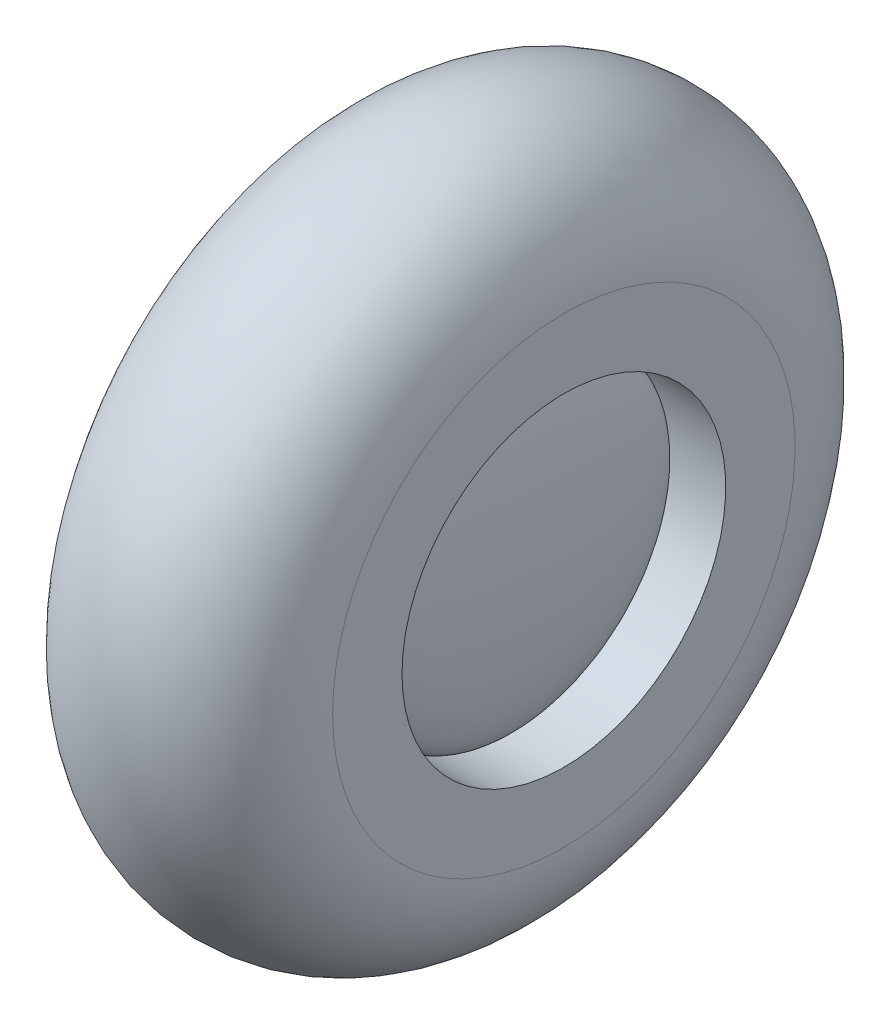
ISO-10303-21;
HEADER;
FILE_DESCRIPTION(('STEP AP214'),'2;1');
FILE_NAME('part.step','',(''),(''),'','','');
FILE_SCHEMA(('AUTOMOTIVE_DESIGN { 1 0 10303 214 1 1 1 1 }'));
ENDSEC;
DATA;
#1=APPLICATION_CONTEXT('core data for automotive mechanical design processes');
#2=APPLICATION_PROTOCOL_DEFINITION('international standard','automotive_design',2000,#1);
#3=PRODUCT_CONTEXT('',#1,'mechanical');
#4=PRODUCT('Part','Part','',(#3));
#5=PRODUCT_RELATED_PRODUCT_CATEGORY('part','',(#4));
#6=PRODUCT_DEFINITION_FORMATION('','',#4);
#7=PRODUCT_DEFINITION_CONTEXT('part definition',#1,'design');
#8=PRODUCT_DEFINITION('design','',#6,#7);
#9=PRODUCT_DEFINITION_SHAPE('','',#8);
#10=(LENGTH_UNIT() NAMED_UNIT(*) SI_UNIT(.MILLI.,.METRE.));
#11=(NAMED_UNIT(*) PLANE_ANGLE_UNIT() SI_UNIT($,.RADIAN.));
#12=(NAMED_UNIT(*) SI_UNIT($,.STERADIAN.) SOLID_ANGLE_UNIT());
#13=UNCERTAINTY_MEASURE_WITH_UNIT(LENGTH_MEASURE(1.E-05),#10,'distance_accuracy_value','');
#14=(GEOMETRIC_REPRESENTATION_CONTEXT(3) GLOBAL_UNCERTAINTY_ASSIGNED_CONTEXT((#13)) GLOBAL_UNIT_ASSIGNED_CONTEXT((#10,
#11,#12)) REPRESENTATION_CONTEXT('',''));
#15=CARTESIAN_POINT('',(0.,0.,0.));
#16=DIRECTION('',(0.,0.,1.));
#17=DIRECTION('',(1.,0.,0.));
#18=AXIS2_PLACEMENT_3D('',#15,#16,#17);
#19=CARTESIAN_POINT('',(82.8675,0.,0.));
#20=CARTESIAN_POINT('',(82.8675,43.6827159275502,0.));
#21=CARTESIAN_POINT('',(77.6979837296915,150.6855,0.));
#22=CARTESIAN_POINT('',(55.245,150.6855,0.));
#23=B_SPLINE_CURVE_WITH_KNOTS('',3,(#19,#20,#21,#22),.UNSPECIFIED.,.F.,.F.,(4,4),(0.,1.),.UNSPECIFIED.);
#24=CARTESIAN_POINT('',(0.,0.,0.));
#25=DIRECTION('',(-1.,0.,0.));
#26=AXIS1_PLACEMENT('',#24,#25);
#27=SURFACE_OF_REVOLUTION('',#23,#26);
#28=CARTESIAN_POINT('',(55.245,0.,0.));
#29=DIRECTION('',(-1.,0.,0.));
#30=DIRECTION('',(0.,0.,1.));
#31=AXIS2_PLACEMENT_3D('',#28,#29,#30);
#32=CIRCLE('',#31,150.6855);
#33=CARTESIAN_POINT('',(55.245,0.,150.6855));
#34=VERTEX_POINT('',#33);
#35=EDGE_CURVE('E11',#34,#34,#32,.T.);
#36=ORIENTED_EDGE('',*,*,#35,.F.);
#37=EDGE_LOOP('',(#36));
#38=FACE_BOUND('',#37,.T.);
#39=CARTESIAN_POINT('',(82.8675,0.,0.));
#40=VERTEX_POINT('',#39);
#41=VERTEX_LOOP('',#40);
#42=FACE_BOUND('',#41,.T.);
#43=ADVANCED_FACE('F36',(#38,#42),#27,.T.);
#44=CARTESIAN_POINT('',(0.,0.,0.));
#45=DIRECTION('',(-1.,0.,0.));
#46=DIRECTION('',(0.,0.,1.));
#47=AXIS2_PLACEMENT_3D('',#44,#45,#46);
#48=CYLINDRICAL_SURFACE('',#47,150.6855);
#49=CARTESIAN_POINT('',(110.49,0.,0.));
#50=DIRECTION('',(-1.,0.,0.));
#51=DIRECTION('',(0.,0.,1.));
#52=AXIS2_PLACEMENT_3D('',#49,#50,#51);
#53=CIRCLE('',#52,150.6855);
#54=CARTESIAN_POINT('',(110.49,0.,150.6855));
#55=VERTEX_POINT('',#54);
#56=EDGE_CURVE('E44',#55,#55,#53,.T.);
#57=ORIENTED_EDGE('',*,*,#56,.F.);
#58=EDGE_LOOP('',(#57));
#59=FACE_BOUND('',#58,.T.);
#60=ORIENTED_EDGE('',*,*,#35,.T.);
#61=EDGE_LOOP('',(#60));
#62=FACE_BOUND('',#61,.T.);
#63=ADVANCED_FACE('F78',(#59,#62),#48,.F.);
#64=CARTESIAN_POINT('',(110.49,150.6855,0.));
#65=DIRECTION('',(-1.,0.,0.));
#66=DIRECTION('',(0.,0.,1.));
#67=AXIS2_PLACEMENT_3D('',#64,#65,#66);
#68=PLANE('',#67);
#69=CARTESIAN_POINT('',(110.49,0.,0.));
#70=DIRECTION('',(-1.,0.,0.));
#71=DIRECTION('',(0.,0.,1.));
#72=AXIS2_PLACEMENT_3D('',#69,#70,#71);
#73=CIRCLE('',#72,215.265);
#74=CARTESIAN_POINT('',(110.49,0.,215.265));
#75=VERTEX_POINT('',#74);
#76=EDGE_CURVE('E71',#75,#75,#73,.T.);
#77=ORIENTED_EDGE('',*,*,#76,.F.);
#78=EDGE_LOOP('',(#77));
#79=FACE_BOUND('',#78,.T.);
#80=ORIENTED_EDGE('',*,*,#56,.T.);
#81=EDGE_LOOP('',(#80));
#82=FACE_BOUND('',#81,.T.);
#83=ADVANCED_FACE('F76',(#79,#82),#68,.F.);
#84=CARTESIAN_POINT('',(0.,0.,0.));
#85=DIRECTION('',(-1.,0.,0.));
#86=DIRECTION('',(0.,0.,1.));
#87=AXIS2_PLACEMENT_3D('',#84,#85,#86);
#88=TOROIDAL_SURFACE('',#87,215.265,110.49);
#89=CARTESIAN_POINT('',(-110.49,0.,0.));
#90=DIRECTION('',(-1.,0.,0.));
#91=DIRECTION('',(0.,0.,1.));
#92=AXIS2_PLACEMENT_3D('',#89,#90,#91);
#93=CIRCLE('',#92,215.265);
#94=CARTESIAN_POINT('',(-110.49,0.,215.265));
#95=VERTEX_POINT('',#94);
#96=EDGE_CURVE('E62',#95,#95,#93,.T.);
#97=ORIENTED_EDGE('',*,*,#96,.F.);
#98=EDGE_LOOP('',(#97));
#99=FACE_BOUND('',#98,.T.);
#100=ORIENTED_EDGE('',*,*,#76,.T.);
#101=EDGE_LOOP('',(#100));
#102=FACE_BOUND('',#101,.T.);
#103=ADVANCED_FACE('F97',(#99,#102),#88,.T.);
#104=CARTESIAN_POINT('',(-110.49,150.6855,0.));
#105=DIRECTION('',(1.,0.,0.));
#106=DIRECTION('',(0.,0.,-1.));
#107=AXIS2_PLACEMENT_3D('',#104,#105,#106);
#108=PLANE('',#107);
#109=CARTESIAN_POINT('',(-110.49,0.,0.));
#110=DIRECTION('',(-1.,0.,0.));
#111=DIRECTION('',(0.,0.,1.));
#112=AXIS2_PLACEMENT_3D('',#109,#110,#111);
#113=CIRCLE('',#112,150.6855);
#114=CARTESIAN_POINT('',(-110.49,0.,150.6855));
#115=VERTEX_POINT('',#114);
#116=EDGE_CURVE('E59',#115,#115,#113,.T.);
#117=ORIENTED_EDGE('',*,*,#116,.F.);
#118=EDGE_LOOP('',(#117));
#119=FACE_BOUND('',#118,.T.);
#120=ORIENTED_EDGE('',*,*,#96,.T.);
#121=EDGE_LOOP('',(#120));
#122=FACE_BOUND('',#121,.T.);
#123=ADVANCED_FACE('F105',(#119,#122),#108,.F.);
#124=CARTESIAN_POINT('',(0.,0.,0.));
#125=DIRECTION('',(-1.,0.,0.));
#126=DIRECTION('',(0.,0.,1.));
#127=AXIS2_PLACEMENT_3D('',#124,#125,#126);
#128=CYLINDRICAL_SURFACE('',#127,150.6855);
#129=CARTESIAN_POINT('',(-55.245,0.,0.));
#130=DIRECTION('',(-1.,0.,0.));
#131=DIRECTION('',(0.,0.,1.));
#132=AXIS2_PLACEMENT_3D('',#129,#130,#131);
#133=CIRCLE('',#132,150.6855);
#134=CARTESIAN_POINT('',(-55.245,0.,150.6855));
#135=VERTEX_POINT('',#134);
#136=EDGE_CURVE('E57',#135,#135,#133,.T.);
#137=ORIENTED_EDGE('',*,*,#136,.F.);
#138=EDGE_LOOP('',(#137));
#139=FACE_BOUND('',#138,.T.);
#140=ORIENTED_EDGE('',*,*,#116,.T.);
#141=EDGE_LOOP('',(#140));
#142=FACE_BOUND('',#141,.T.);
#143=ADVANCED_FACE('F53',(#139,#142),#128,.F.);
#144=CARTESIAN_POINT('',(-55.245,150.6855,0.));
#145=CARTESIAN_POINT('',(-77.6979837296915,150.6855,0.));
#146=CARTESIAN_POINT('',(-82.8675,43.6827159275502,0.));
#147=CARTESIAN_POINT('',(-82.8675,0.,0.));
#148=B_SPLINE_CURVE_WITH_KNOTS('',3,(#144,#145,#146,#147),.UNSPECIFIED.,.F.,.F.,(4,4),(0.,1.),.UNSPECIFIED.);
#149=CARTESIAN_POINT('',(0.,0.,0.));
#150=DIRECTION('',(-1.,0.,0.));
#151=AXIS1_PLACEMENT('',#149,#150);
#152=SURFACE_OF_REVOLUTION('',#148,#151);
#153=CARTESIAN_POINT('',(-82.8675,0.,0.));
#154=VERTEX_POINT('',#153);
#155=VERTEX_LOOP('',#154);
#156=FACE_BOUND('',#155,.T.);
#157=ORIENTED_EDGE('',*,*,#136,.T.);
#158=EDGE_LOOP('',(#157));
#159=FACE_BOUND('',#158,.T.);
#160=ADVANCED_FACE('F50',(#156,#159),#152,.T.);
#161=CLOSED_SHELL('',(#43,#63,#83,#103,#123,#143,#160));
#162=MANIFOLD_SOLID_BREP('B2',#161);
#163=ADVANCED_BREP_SHAPE_REPRESENTATION('',(#18,#162),#14);
#164=SHAPE_DEFINITION_REPRESENTATION(#9,#163);
ENDSEC;
END-ISO-10303-21;
